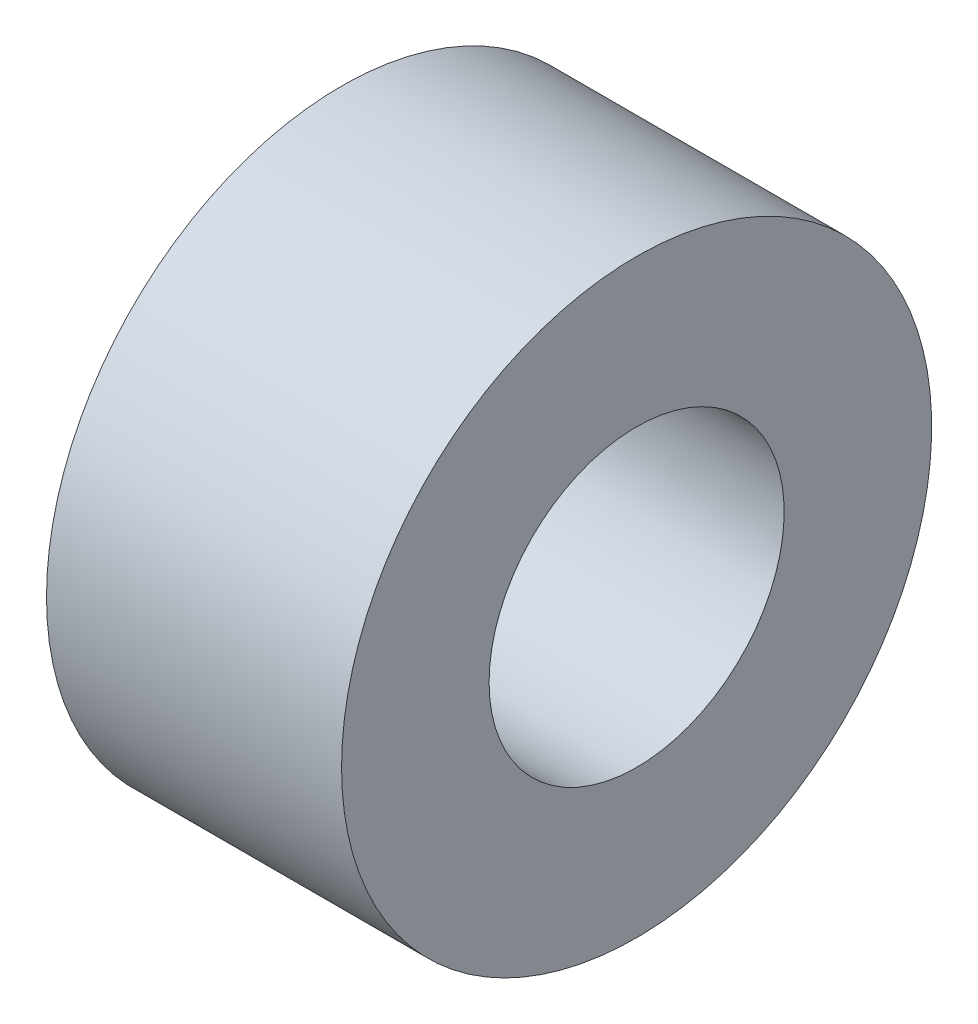
ISO-10303-21;
HEADER;
FILE_DESCRIPTION(('STEP AP214'),'2;1');
FILE_NAME('part.step','',(''),(''),'','','');
FILE_SCHEMA(('AUTOMOTIVE_DESIGN { 1 0 10303 214 1 1 1 1 }'));
ENDSEC;
DATA;
#1=APPLICATION_CONTEXT('core data for automotive mechanical design processes');
#2=APPLICATION_PROTOCOL_DEFINITION('international standard','automotive_design',2000,#1);
#3=PRODUCT_CONTEXT('',#1,'mechanical');
#4=PRODUCT('Part','Part','',(#3));
#5=PRODUCT_RELATED_PRODUCT_CATEGORY('part','',(#4));
#6=PRODUCT_DEFINITION_FORMATION('','',#4);
#7=PRODUCT_DEFINITION_CONTEXT('part definition',#1,'design');
#8=PRODUCT_DEFINITION('design','',#6,#7);
#9=PRODUCT_DEFINITION_SHAPE('','',#8);
#10=(LENGTH_UNIT() NAMED_UNIT(*) SI_UNIT(.MILLI.,.METRE.));
#11=(NAMED_UNIT(*) PLANE_ANGLE_UNIT() SI_UNIT($,.RADIAN.));
#12=(NAMED_UNIT(*) SI_UNIT($,.STERADIAN.) SOLID_ANGLE_UNIT());
#13=UNCERTAINTY_MEASURE_WITH_UNIT(LENGTH_MEASURE(1.E-05),#10,'distance_accuracy_value','');
#14=(GEOMETRIC_REPRESENTATION_CONTEXT(3) GLOBAL_UNCERTAINTY_ASSIGNED_CONTEXT((#13)) GLOBAL_UNIT_ASSIGNED_CONTEXT((#10,
#11,#12)) REPRESENTATION_CONTEXT('',''));
#15=CARTESIAN_POINT('',(0.,0.,0.));
#16=DIRECTION('',(0.,0.,1.));
#17=DIRECTION('',(1.,0.,0.));
#18=AXIS2_PLACEMENT_3D('',#15,#16,#17);
#19=CARTESIAN_POINT('',(9.525,0.,0.));
#20=DIRECTION('',(1.,0.,0.));
#21=DIRECTION('',(0.,0.,-1.));
#22=AXIS2_PLACEMENT_3D('',#19,#20,#21);
#23=PLANE('',#22);
#24=CARTESIAN_POINT('',(9.525,0.,0.));
#25=DIRECTION('',(1.,0.,0.));
#26=DIRECTION('',(0.,0.,-1.));
#27=AXIS2_PLACEMENT_3D('',#24,#25,#26);
#28=CIRCLE('',#27,9.525);
#29=CARTESIAN_POINT('',(9.525,0.,9.525));
#30=VERTEX_POINT('',#29);
#31=EDGE_CURVE('E10',#30,#30,#28,.T.);
#32=ORIENTED_EDGE('',*,*,#31,.T.);
#33=EDGE_LOOP('',(#32));
#34=FACE_BOUND('',#33,.T.);
#35=CARTESIAN_POINT('',(9.525,0.,0.));
#36=DIRECTION('',(1.,0.,0.));
#37=DIRECTION('',(0.,0.,-1.));
#38=AXIS2_PLACEMENT_3D('',#35,#36,#37);
#39=CIRCLE('',#38,4.7625);
#40=CARTESIAN_POINT('',(9.525,0.,4.7625));
#41=VERTEX_POINT('',#40);
#42=EDGE_CURVE('E50',#41,#41,#39,.T.);
#43=ORIENTED_EDGE('',*,*,#42,.F.);
#44=EDGE_LOOP('',(#43));
#45=FACE_BOUND('',#44,.T.);
#46=ADVANCED_FACE('F39',(#34,#45),#23,.T.);
#47=CARTESIAN_POINT('',(0.,0.,0.));
#48=DIRECTION('',(1.,0.,0.));
#49=DIRECTION('',(0.,0.,-1.));
#50=AXIS2_PLACEMENT_3D('',#47,#48,#49);
#51=PLANE('',#50);
#52=CARTESIAN_POINT('',(0.,0.,0.));
#53=DIRECTION('',(1.,0.,0.));
#54=DIRECTION('',(0.,0.,-1.));
#55=AXIS2_PLACEMENT_3D('',#52,#53,#54);
#56=CIRCLE('',#55,9.525);
#57=CARTESIAN_POINT('',(0.,0.,9.525));
#58=VERTEX_POINT('',#57);
#59=EDGE_CURVE('E43',#58,#58,#56,.T.);
#60=ORIENTED_EDGE('',*,*,#59,.F.);
#61=EDGE_LOOP('',(#60));
#62=FACE_BOUND('',#61,.T.);
#63=CARTESIAN_POINT('',(0.,0.,0.));
#64=DIRECTION('',(1.,0.,0.));
#65=DIRECTION('',(0.,0.,-1.));
#66=AXIS2_PLACEMENT_3D('',#63,#64,#65);
#67=CIRCLE('',#66,4.7625);
#68=CARTESIAN_POINT('',(0.,0.,4.7625));
#69=VERTEX_POINT('',#68);
#70=EDGE_CURVE('E52',#69,#69,#67,.T.);
#71=ORIENTED_EDGE('',*,*,#70,.T.);
#72=EDGE_LOOP('',(#71));
#73=FACE_BOUND('',#72,.T.);
#74=ADVANCED_FACE('F62',(#62,#73),#51,.F.);
#75=CARTESIAN_POINT('',(9.525,0.,0.));
#76=DIRECTION('',(-1.,0.,0.));
#77=DIRECTION('',(0.,0.,1.));
#78=AXIS2_PLACEMENT_3D('',#75,#76,#77);
#79=CYLINDRICAL_SURFACE('',#78,9.525);
#80=CARTESIAN_POINT('',(9.525,0.,9.525));
#81=CARTESIAN_POINT('',(9.42578125,0.,9.525));
#82=CARTESIAN_POINT('',(9.3265625,0.,9.525));
#83=CARTESIAN_POINT('',(9.128125,0.,9.525));
#84=CARTESIAN_POINT('',(9.02890625,0.,9.525));
#85=CARTESIAN_POINT('',(8.83046875,0.,9.525));
#86=CARTESIAN_POINT('',(8.73125,0.,9.525));
#87=CARTESIAN_POINT('',(8.5328125,0.,9.525));
#88=CARTESIAN_POINT('',(8.43359375,0.,9.525));
#89=CARTESIAN_POINT('',(8.23515625,0.,9.525));
#90=CARTESIAN_POINT('',(8.1359375,0.,9.525));
#91=CARTESIAN_POINT('',(7.9375,0.,9.525));
#92=CARTESIAN_POINT('',(7.83828125,0.,9.525));
#93=CARTESIAN_POINT('',(7.63984375,0.,9.525));
#94=CARTESIAN_POINT('',(7.540625,0.,9.525));
#95=CARTESIAN_POINT('',(7.3421875,0.,9.525));
#96=CARTESIAN_POINT('',(7.24296875,0.,9.525));
#97=CARTESIAN_POINT('',(7.04453125,0.,9.525));
#98=CARTESIAN_POINT('',(6.9453125,0.,9.525));
#99=CARTESIAN_POINT('',(6.746875,0.,9.525));
#100=CARTESIAN_POINT('',(6.64765625,0.,9.525));
#101=CARTESIAN_POINT('',(6.44921875,0.,9.525));
#102=CARTESIAN_POINT('',(6.35,0.,9.525));
#103=CARTESIAN_POINT('',(6.1515625,0.,9.525));
#104=CARTESIAN_POINT('',(6.05234375,0.,9.525));
#105=CARTESIAN_POINT('',(5.85390625,0.,9.525));
#106=CARTESIAN_POINT('',(5.7546875,0.,9.525));
#107=CARTESIAN_POINT('',(5.55625,0.,9.525));
#108=CARTESIAN_POINT('',(5.45703125,0.,9.525));
#109=CARTESIAN_POINT('',(5.25859375,0.,9.525));
#110=CARTESIAN_POINT('',(5.159375,0.,9.525));
#111=CARTESIAN_POINT('',(4.9609375,0.,9.525));
#112=CARTESIAN_POINT('',(4.86171875,0.,9.525));
#113=CARTESIAN_POINT('',(4.66328125,0.,9.525));
#114=CARTESIAN_POINT('',(4.5640625,0.,9.525));
#115=CARTESIAN_POINT('',(4.365625,0.,9.525));
#116=CARTESIAN_POINT('',(4.26640625,0.,9.525));
#117=CARTESIAN_POINT('',(4.06796875,0.,9.525));
#118=CARTESIAN_POINT('',(3.96875,0.,9.525));
#119=CARTESIAN_POINT('',(3.7703125,0.,9.525));
#120=CARTESIAN_POINT('',(3.67109375,0.,9.525));
#121=CARTESIAN_POINT('',(3.47265625,0.,9.525));
#122=CARTESIAN_POINT('',(3.3734375,0.,9.525));
#123=CARTESIAN_POINT('',(3.175,0.,9.525));
#124=CARTESIAN_POINT('',(3.07578125,0.,9.525));
#125=CARTESIAN_POINT('',(2.87734375,0.,9.525));
#126=CARTESIAN_POINT('',(2.778125,0.,9.525));
#127=CARTESIAN_POINT('',(2.5796875,0.,9.525));
#128=CARTESIAN_POINT('',(2.48046875,0.,9.525));
#129=CARTESIAN_POINT('',(2.28203125,0.,9.525));
#130=CARTESIAN_POINT('',(2.1828125,0.,9.525));
#131=CARTESIAN_POINT('',(1.984375,0.,9.525));
#132=CARTESIAN_POINT('',(1.88515625,0.,9.525));
#133=CARTESIAN_POINT('',(1.68671875,0.,9.525));
#134=CARTESIAN_POINT('',(1.5875,0.,9.525));
#135=CARTESIAN_POINT('',(1.3890625,0.,9.525));
#136=CARTESIAN_POINT('',(1.28984375,0.,9.525));
#137=CARTESIAN_POINT('',(1.09140625,0.,9.525));
#138=CARTESIAN_POINT('',(0.992187500000001,0.,9.525));
#139=CARTESIAN_POINT('',(0.793750000000001,0.,9.525));
#140=CARTESIAN_POINT('',(0.69453125,0.,9.525));
#141=CARTESIAN_POINT('',(0.49609375,0.,9.525));
#142=CARTESIAN_POINT('',(0.396875,0.,9.525));
#143=CARTESIAN_POINT('',(0.1984375,0.,9.525));
#144=CARTESIAN_POINT('',(0.0992187500000001,0.,9.525));
#145=CARTESIAN_POINT('',(0.,0.,9.525));
#146=B_SPLINE_CURVE_WITH_KNOTS('',3,(#80,#81,#82,#83,#84,#85,#86,#87,#88,#89,#90,#91,#92,#93,
#94,#95,#96,#97,#98,#99,#100,#101,#102,#103,#104,#105,#106,#107,#108,#109,#110,#111,#112,#113,
#114,#115,#116,#117,#118,#119,#120,#121,#122,#123,#124,#125,#126,#127,#128,#129,#130,#131,#132,
#133,#134,#135,#136,#137,#138,#139,#140,#141,#142,#143,#144,#145),.UNSPECIFIED.,.F.,.F.,(4,2,2,
2,2,2,2,2,2,2,2,2,2,2,2,2,2,2,2,2,2,2,2,2,2,2,2,2,2,2,2,2,4),(0.,0.29765625,0.5953125,
0.892968750000001,1.190625,1.48828125,1.7859375,2.08359375,2.38125,2.67890625,2.9765625,
3.27421875,3.571875,3.86953125,4.1671875,4.46484375,4.7625,5.06015625,5.3578125,5.65546875,
5.953125,6.25078125,6.5484375,6.84609375,7.14375,7.44140625,7.7390625,8.03671875,8.334375,
8.63203125,8.9296875,9.22734375,9.525),.UNSPECIFIED.);
#147=EDGE_CURVE('BSEAM41',#30,#58,#146,.T.);
#148=ORIENTED_EDGE('',*,*,#31,.F.);
#149=ORIENTED_EDGE('',*,*,#59,.T.);
#150=ORIENTED_EDGE('',*,*,#147,.T.);
#151=ORIENTED_EDGE('',*,*,#147,.F.);
#152=EDGE_LOOP('',(#148,#150,#149,#151));
#153=FACE_BOUND('',#152,.T.);
#154=ADVANCED_FACE('F41',(#153),#79,.T.);
#155=CARTESIAN_POINT('',(9.525,0.,0.));
#156=DIRECTION('',(-1.,0.,0.));
#157=DIRECTION('',(0.,0.,1.));
#158=AXIS2_PLACEMENT_3D('',#155,#156,#157);
#159=CYLINDRICAL_SURFACE('',#158,4.7625);
#160=CARTESIAN_POINT('',(9.525,0.,4.7625));
#161=CARTESIAN_POINT('',(9.42578125,0.,4.7625));
#162=CARTESIAN_POINT('',(9.3265625,0.,4.7625));
#163=CARTESIAN_POINT('',(9.128125,0.,4.7625));
#164=CARTESIAN_POINT('',(9.02890625,0.,4.7625));
#165=CARTESIAN_POINT('',(8.83046875,0.,4.7625));
#166=CARTESIAN_POINT('',(8.73125,0.,4.7625));
#167=CARTESIAN_POINT('',(8.5328125,0.,4.7625));
#168=CARTESIAN_POINT('',(8.43359375,0.,4.7625));
#169=CARTESIAN_POINT('',(8.23515625,0.,4.7625));
#170=CARTESIAN_POINT('',(8.1359375,0.,4.7625));
#171=CARTESIAN_POINT('',(7.9375,0.,4.7625));
#172=CARTESIAN_POINT('',(7.83828125,0.,4.7625));
#173=CARTESIAN_POINT('',(7.63984375,0.,4.7625));
#174=CARTESIAN_POINT('',(7.540625,0.,4.7625));
#175=CARTESIAN_POINT('',(7.3421875,0.,4.7625));
#176=CARTESIAN_POINT('',(7.24296875,0.,4.7625));
#177=CARTESIAN_POINT('',(7.04453125,0.,4.7625));
#178=CARTESIAN_POINT('',(6.9453125,0.,4.7625));
#179=CARTESIAN_POINT('',(6.746875,0.,4.7625));
#180=CARTESIAN_POINT('',(6.64765625,0.,4.7625));
#181=CARTESIAN_POINT('',(6.44921875,0.,4.7625));
#182=CARTESIAN_POINT('',(6.35,0.,4.7625));
#183=CARTESIAN_POINT('',(6.1515625,0.,4.7625));
#184=CARTESIAN_POINT('',(6.05234375,0.,4.7625));
#185=CARTESIAN_POINT('',(5.85390625,0.,4.7625));
#186=CARTESIAN_POINT('',(5.7546875,0.,4.7625));
#187=CARTESIAN_POINT('',(5.55625,0.,4.7625));
#188=CARTESIAN_POINT('',(5.45703125,0.,4.7625));
#189=CARTESIAN_POINT('',(5.25859375,0.,4.7625));
#190=CARTESIAN_POINT('',(5.159375,0.,4.7625));
#191=CARTESIAN_POINT('',(4.9609375,0.,4.7625));
#192=CARTESIAN_POINT('',(4.86171875,0.,4.7625));
#193=CARTESIAN_POINT('',(4.66328125,0.,4.7625));
#194=CARTESIAN_POINT('',(4.5640625,0.,4.7625));
#195=CARTESIAN_POINT('',(4.365625,0.,4.7625));
#196=CARTESIAN_POINT('',(4.26640625,0.,4.7625));
#197=CARTESIAN_POINT('',(4.06796875,0.,4.7625));
#198=CARTESIAN_POINT('',(3.96875,0.,4.7625));
#199=CARTESIAN_POINT('',(3.7703125,0.,4.7625));
#200=CARTESIAN_POINT('',(3.67109375,0.,4.7625));
#201=CARTESIAN_POINT('',(3.47265625,0.,4.7625));
#202=CARTESIAN_POINT('',(3.3734375,0.,4.7625));
#203=CARTESIAN_POINT('',(3.175,0.,4.7625));
#204=CARTESIAN_POINT('',(3.07578125,0.,4.7625));
#205=CARTESIAN_POINT('',(2.87734375,0.,4.7625));
#206=CARTESIAN_POINT('',(2.778125,0.,4.7625));
#207=CARTESIAN_POINT('',(2.5796875,0.,4.7625));
#208=CARTESIAN_POINT('',(2.48046875,0.,4.7625));
#209=CARTESIAN_POINT('',(2.28203125,0.,4.7625));
#210=CARTESIAN_POINT('',(2.1828125,0.,4.7625));
#211=CARTESIAN_POINT('',(1.984375,0.,4.7625));
#212=CARTESIAN_POINT('',(1.88515625,0.,4.7625));
#213=CARTESIAN_POINT('',(1.68671875,0.,4.7625));
#214=CARTESIAN_POINT('',(1.5875,0.,4.7625));
#215=CARTESIAN_POINT('',(1.3890625,0.,4.7625));
#216=CARTESIAN_POINT('',(1.28984375,0.,4.7625));
#217=CARTESIAN_POINT('',(1.09140625,0.,4.7625));
#218=CARTESIAN_POINT('',(0.992187500000001,0.,4.7625));
#219=CARTESIAN_POINT('',(0.793750000000001,0.,4.7625));
#220=CARTESIAN_POINT('',(0.69453125,0.,4.7625));
#221=CARTESIAN_POINT('',(0.49609375,0.,4.7625));
#222=CARTESIAN_POINT('',(0.396875,0.,4.7625));
#223=CARTESIAN_POINT('',(0.1984375,0.,4.7625));
#224=CARTESIAN_POINT('',(0.0992187500000001,0.,4.7625));
#225=CARTESIAN_POINT('',(0.,0.,4.7625));
#226=B_SPLINE_CURVE_WITH_KNOTS('',3,(#160,#161,#162,#163,#164,#165,#166,#167,#168,#169,#170,
#171,#172,#173,#174,#175,#176,#177,#178,#179,#180,#181,#182,#183,#184,#185,#186,#187,#188,#189,
#190,#191,#192,#193,#194,#195,#196,#197,#198,#199,#200,#201,#202,#203,#204,#205,#206,#207,#208,
#209,#210,#211,#212,#213,#214,#215,#216,#217,#218,#219,#220,#221,#222,#223,#224,#225),
.UNSPECIFIED.,.F.,.F.,(4,2,2,2,2,2,2,2,2,2,2,2,2,2,2,2,2,2,2,2,2,2,2,2,2,2,2,2,2,2,2,2,4),(0.,
0.29765625,0.5953125,0.892968750000001,1.190625,1.48828125,1.7859375,2.08359375,2.38125,
2.67890625,2.9765625,3.27421875,3.571875,3.86953125,4.1671875,4.46484375,4.7625,5.06015625,
5.3578125,5.65546875,5.953125,6.25078125,6.5484375,6.84609375,7.14375,7.44140625,7.7390625,
8.03671875,8.334375,8.63203125,8.9296875,9.22734375,9.525),.UNSPECIFIED.);
#227=EDGE_CURVE('BSEAM58',#41,#69,#226,.T.);
#228=ORIENTED_EDGE('',*,*,#42,.T.);
#229=ORIENTED_EDGE('',*,*,#70,.F.);
#230=ORIENTED_EDGE('',*,*,#227,.T.);
#231=ORIENTED_EDGE('',*,*,#227,.F.);
#232=EDGE_LOOP('',(#228,#230,#229,#231));
#233=FACE_BOUND('',#232,.T.);
#234=ADVANCED_FACE('F58',(#233),#159,.F.);
#235=CLOSED_SHELL('',(#46,#74,#154,#234));
#236=MANIFOLD_SOLID_BREP('B2',#235);
#237=ADVANCED_BREP_SHAPE_REPRESENTATION('',(#18,#236),#14);
#238=SHAPE_DEFINITION_REPRESENTATION(#9,#237);
ENDSEC;
END-ISO-10303-21;
